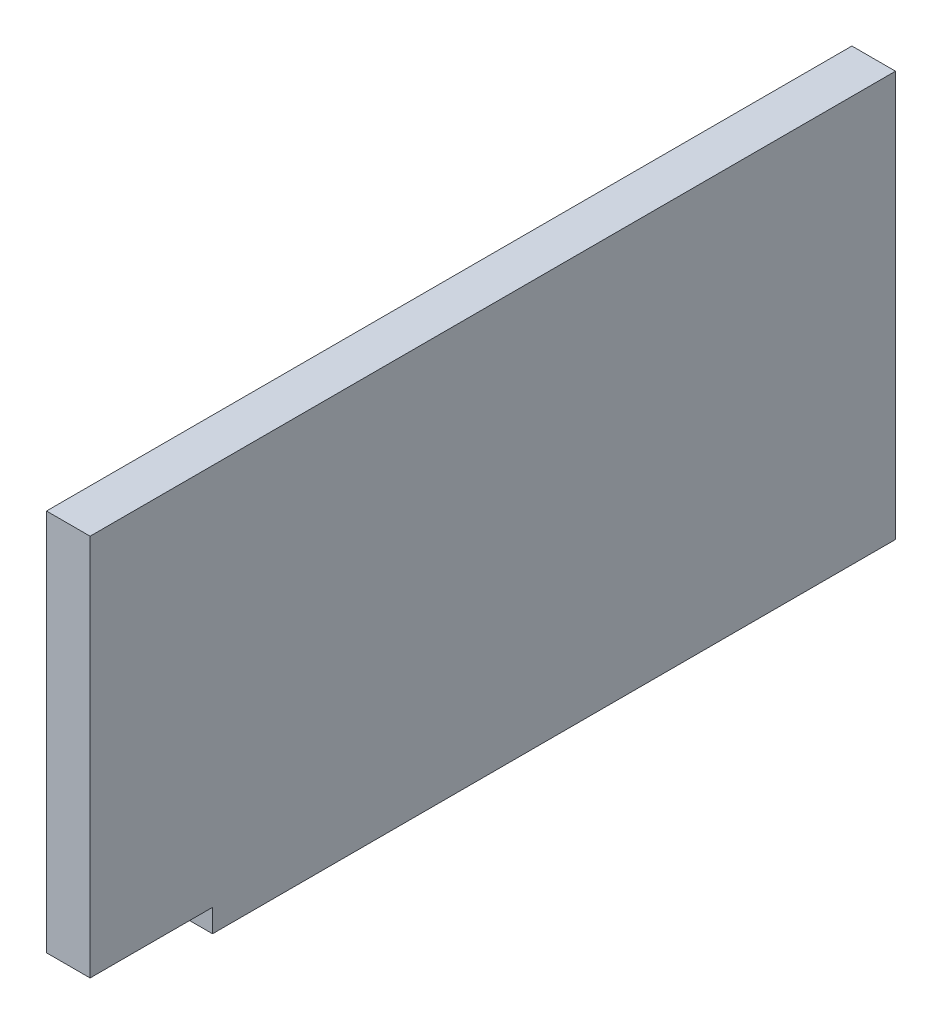
ISO-10303-21;
HEADER;
FILE_DESCRIPTION(('STEP AP214'),'2;1');
FILE_NAME('part.step','',(''),(''),'','','');
FILE_SCHEMA(('AUTOMOTIVE_DESIGN { 1 0 10303 214 1 1 1 1 }'));
ENDSEC;
DATA;
#1=APPLICATION_CONTEXT('core data for automotive mechanical design processes');
#2=APPLICATION_PROTOCOL_DEFINITION('international standard','automotive_design',2000,#1);
#3=PRODUCT_CONTEXT('',#1,'mechanical');
#4=PRODUCT('Part','Part','',(#3));
#5=PRODUCT_RELATED_PRODUCT_CATEGORY('part','',(#4));
#6=PRODUCT_DEFINITION_FORMATION('','',#4);
#7=PRODUCT_DEFINITION_CONTEXT('part definition',#1,'design');
#8=PRODUCT_DEFINITION('design','',#6,#7);
#9=PRODUCT_DEFINITION_SHAPE('','',#8);
#10=(LENGTH_UNIT() NAMED_UNIT(*) SI_UNIT(.MILLI.,.METRE.));
#11=(NAMED_UNIT(*) PLANE_ANGLE_UNIT() SI_UNIT($,.RADIAN.));
#12=(NAMED_UNIT(*) SI_UNIT($,.STERADIAN.) SOLID_ANGLE_UNIT());
#13=UNCERTAINTY_MEASURE_WITH_UNIT(LENGTH_MEASURE(1.E-05),#10,'distance_accuracy_value','');
#14=(GEOMETRIC_REPRESENTATION_CONTEXT(3) GLOBAL_UNCERTAINTY_ASSIGNED_CONTEXT((#13)) GLOBAL_UNIT_ASSIGNED_CONTEXT((#10,
#11,#12)) REPRESENTATION_CONTEXT('',''));
#15=CARTESIAN_POINT('',(0.,0.,0.));
#16=DIRECTION('',(0.,0.,1.));
#17=DIRECTION('',(1.,0.,0.));
#18=AXIS2_PLACEMENT_3D('',#15,#16,#17);
#19=CARTESIAN_POINT('',(-2.85,26.5,52.625));
#20=DIRECTION('',(0.,-1.,0.));
#21=DIRECTION('',(0.,0.,-1.));
#22=AXIS2_PLACEMENT_3D('',#19,#20,#21);
#23=PLANE('',#22);
#24=DIRECTION('',(1.,0.,0.));
#25=VECTOR('',#24,1.);
#26=CARTESIAN_POINT('',(-2.85,26.5,52.625));
#27=LINE('',#26,#25);
#28=CARTESIAN_POINT('',(-2.85,26.5,52.625));
#29=VERTEX_POINT('',#28);
#30=CARTESIAN_POINT('',(2.85,26.5,52.625));
#31=VERTEX_POINT('',#30);
#32=EDGE_CURVE('E63',#29,#31,#27,.T.);
#33=ORIENTED_EDGE('',*,*,#32,.T.);
#34=DIRECTION('',(0.,0.,-1.));
#35=VECTOR('',#34,1.);
#36=CARTESIAN_POINT('',(2.85,26.5,52.625));
#37=LINE('',#36,#35);
#38=CARTESIAN_POINT('',(2.85,26.5,-52.625));
#39=VERTEX_POINT('',#38);
#40=EDGE_CURVE('E130',#31,#39,#37,.T.);
#41=ORIENTED_EDGE('',*,*,#40,.T.);
#42=DIRECTION('',(1.,0.,0.));
#43=VECTOR('',#42,1.);
#44=CARTESIAN_POINT('',(-2.85,26.5,-52.625));
#45=LINE('',#44,#43);
#46=CARTESIAN_POINT('',(-2.85,26.5,-52.625));
#47=VERTEX_POINT('',#46);
#48=EDGE_CURVE('E11',#47,#39,#45,.T.);
#49=ORIENTED_EDGE('',*,*,#48,.F.);
#50=DIRECTION('',(0.,0.,-1.));
#51=VECTOR('',#50,1.);
#52=CARTESIAN_POINT('',(-2.85,26.5,52.625));
#53=LINE('',#52,#51);
#54=EDGE_CURVE('E117',#29,#47,#53,.T.);
#55=ORIENTED_EDGE('',*,*,#54,.F.);
#56=EDGE_LOOP('',(#33,#41,#49,#55));
#57=FACE_BOUND('',#56,.T.);
#58=ADVANCED_FACE('F41',(#57),#23,.F.);
#59=CARTESIAN_POINT('',(-2.85,26.5,-52.625));
#60=DIRECTION('',(0.,0.,1.));
#61=DIRECTION('',(1.,0.,0.));
#62=AXIS2_PLACEMENT_3D('',#59,#60,#61);
#63=PLANE('',#62);
#64=ORIENTED_EDGE('',*,*,#48,.T.);
#65=DIRECTION('',(0.,-1.,0.));
#66=VECTOR('',#65,1.);
#67=CARTESIAN_POINT('',(2.85,26.5,-52.625));
#68=LINE('',#67,#66);
#69=CARTESIAN_POINT('',(2.85,-26.5,-52.625));
#70=VERTEX_POINT('',#69);
#71=EDGE_CURVE('E124',#39,#70,#68,.T.);
#72=ORIENTED_EDGE('',*,*,#71,.T.);
#73=DIRECTION('',(1.,0.,0.));
#74=VECTOR('',#73,1.);
#75=CARTESIAN_POINT('',(-2.85,-26.5,-52.625));
#76=LINE('',#75,#74);
#77=CARTESIAN_POINT('',(-2.85,-26.5,-52.625));
#78=VERTEX_POINT('',#77);
#79=EDGE_CURVE('E48',#78,#70,#76,.T.);
#80=ORIENTED_EDGE('',*,*,#79,.F.);
#81=DIRECTION('',(0.,-1.,0.));
#82=VECTOR('',#81,1.);
#83=CARTESIAN_POINT('',(-2.85,26.5,-52.625));
#84=LINE('',#83,#82);
#85=EDGE_CURVE('E112',#47,#78,#84,.T.);
#86=ORIENTED_EDGE('',*,*,#85,.F.);
#87=EDGE_LOOP('',(#64,#72,#80,#86));
#88=FACE_BOUND('',#87,.T.);
#89=ADVANCED_FACE('F125',(#88),#63,.F.);
#90=CARTESIAN_POINT('',(-2.85,-26.5,52.625));
#91=DIRECTION('',(0.,-1.,0.));
#92=DIRECTION('',(0.,0.,-1.));
#93=AXIS2_PLACEMENT_3D('',#90,#91,#92);
#94=PLANE('',#93);
#95=DIRECTION('',(1.,0.,0.));
#96=VECTOR('',#95,1.);
#97=CARTESIAN_POINT('',(-2.85,-26.5,36.625));
#98=LINE('',#97,#96);
#99=CARTESIAN_POINT('',(-2.85,-26.5,36.625));
#100=VERTEX_POINT('',#99);
#101=CARTESIAN_POINT('',(2.85,-26.5,36.625));
#102=VERTEX_POINT('',#101);
#103=EDGE_CURVE('E55',#100,#102,#98,.T.);
#104=ORIENTED_EDGE('',*,*,#103,.F.);
#105=DIRECTION('',(0.,0.,-1.));
#106=VECTOR('',#105,1.);
#107=CARTESIAN_POINT('',(-2.85,-26.5,52.625));
#108=LINE('',#107,#106);
#109=EDGE_CURVE('E106',#100,#78,#108,.T.);
#110=ORIENTED_EDGE('',*,*,#109,.T.);
#111=ORIENTED_EDGE('',*,*,#79,.T.);
#112=DIRECTION('',(0.,0.,-1.));
#113=VECTOR('',#112,1.);
#114=CARTESIAN_POINT('',(2.85,-26.5,52.625));
#115=LINE('',#114,#113);
#116=EDGE_CURVE('E108',#102,#70,#115,.T.);
#117=ORIENTED_EDGE('',*,*,#116,.F.);
#118=EDGE_LOOP('',(#104,#110,#111,#117));
#119=FACE_BOUND('',#118,.T.);
#120=ADVANCED_FACE('F104',(#119),#94,.T.);
#121=CARTESIAN_POINT('',(-2.85,26.5,52.625));
#122=DIRECTION('',(0.,0.,1.));
#123=DIRECTION('',(1.,0.,0.));
#124=AXIS2_PLACEMENT_3D('',#121,#122,#123);
#125=PLANE('',#124);
#126=DIRECTION('',(1.,0.,0.));
#127=VECTOR('',#126,1.);
#128=CARTESIAN_POINT('',(-2.85,-23.5,52.625));
#129=LINE('',#128,#127);
#130=CARTESIAN_POINT('',(-2.85,-23.5,52.625));
#131=VERTEX_POINT('',#130);
#132=CARTESIAN_POINT('',(2.85,-23.5,52.625));
#133=VERTEX_POINT('',#132);
#134=EDGE_CURVE('E134',#131,#133,#129,.T.);
#135=ORIENTED_EDGE('',*,*,#134,.T.);
#136=DIRECTION('',(0.,-1.,0.));
#137=VECTOR('',#136,1.);
#138=CARTESIAN_POINT('',(2.85,26.5,52.625));
#139=LINE('',#138,#137);
#140=EDGE_CURVE('E132',#31,#133,#139,.T.);
#141=ORIENTED_EDGE('',*,*,#140,.F.);
#142=ORIENTED_EDGE('',*,*,#32,.F.);
#143=DIRECTION('',(0.,-1.,0.));
#144=VECTOR('',#143,1.);
#145=CARTESIAN_POINT('',(-2.85,26.5,52.625));
#146=LINE('',#145,#144);
#147=EDGE_CURVE('E114',#29,#131,#146,.T.);
#148=ORIENTED_EDGE('',*,*,#147,.T.);
#149=EDGE_LOOP('',(#135,#141,#142,#148));
#150=FACE_BOUND('',#149,.T.);
#151=ADVANCED_FACE('F143',(#150),#125,.T.);
#152=CARTESIAN_POINT('',(-2.85,0.,0.));
#153=DIRECTION('',(-1.,0.,0.));
#154=DIRECTION('',(0.,0.,1.));
#155=AXIS2_PLACEMENT_3D('',#152,#153,#154);
#156=PLANE('',#155);
#157=DIRECTION('',(0.,0.,1.));
#158=VECTOR('',#157,1.);
#159=CARTESIAN_POINT('',(-2.85,-23.5,52.625));
#160=LINE('',#159,#158);
#161=CARTESIAN_POINT('',(-2.85,-23.5,36.625));
#162=VERTEX_POINT('',#161);
#163=EDGE_CURVE('E99',#162,#131,#160,.T.);
#164=ORIENTED_EDGE('',*,*,#163,.T.);
#165=ORIENTED_EDGE('',*,*,#147,.F.);
#166=ORIENTED_EDGE('',*,*,#54,.T.);
#167=ORIENTED_EDGE('',*,*,#85,.T.);
#168=ORIENTED_EDGE('',*,*,#109,.F.);
#169=DIRECTION('',(0.,1.,0.));
#170=VECTOR('',#169,1.);
#171=CARTESIAN_POINT('',(-2.85,-26.5,36.625));
#172=LINE('',#171,#170);
#173=EDGE_CURVE('E92',#100,#162,#172,.T.);
#174=ORIENTED_EDGE('',*,*,#173,.T.);
#175=EDGE_LOOP('',(#164,#165,#166,#167,#168,#174));
#176=FACE_BOUND('',#175,.T.);
#177=ADVANCED_FACE('F110',(#176),#156,.T.);
#178=CARTESIAN_POINT('',(2.85,0.,0.));
#179=DIRECTION('',(-1.,0.,0.));
#180=DIRECTION('',(0.,0.,1.));
#181=AXIS2_PLACEMENT_3D('',#178,#179,#180);
#182=PLANE('',#181);
#183=ORIENTED_EDGE('',*,*,#140,.T.);
#184=DIRECTION('',(0.,0.,1.));
#185=VECTOR('',#184,1.);
#186=CARTESIAN_POINT('',(2.85,-23.5,52.625));
#187=LINE('',#186,#185);
#188=CARTESIAN_POINT('',(2.85,-23.5,36.625));
#189=VERTEX_POINT('',#188);
#190=EDGE_CURVE('E100',#189,#133,#187,.T.);
#191=ORIENTED_EDGE('',*,*,#190,.F.);
#192=DIRECTION('',(0.,1.,0.));
#193=VECTOR('',#192,1.);
#194=CARTESIAN_POINT('',(2.85,-26.5,36.625));
#195=LINE('',#194,#193);
#196=EDGE_CURVE('E149',#102,#189,#195,.T.);
#197=ORIENTED_EDGE('',*,*,#196,.F.);
#198=ORIENTED_EDGE('',*,*,#116,.T.);
#199=ORIENTED_EDGE('',*,*,#71,.F.);
#200=ORIENTED_EDGE('',*,*,#40,.F.);
#201=EDGE_LOOP('',(#183,#191,#197,#198,#199,#200));
#202=FACE_BOUND('',#201,.T.);
#203=ADVANCED_FACE('F140',(#202),#182,.F.);
#204=CARTESIAN_POINT('',(-2.85,-23.5,52.625));
#205=DIRECTION('',(0.,1.,0.));
#206=DIRECTION('',(0.,0.,1.));
#207=AXIS2_PLACEMENT_3D('',#204,#205,#206);
#208=PLANE('',#207);
#209=ORIENTED_EDGE('',*,*,#190,.T.);
#210=ORIENTED_EDGE('',*,*,#134,.F.);
#211=ORIENTED_EDGE('',*,*,#163,.F.);
#212=DIRECTION('',(1.,0.,0.));
#213=VECTOR('',#212,1.);
#214=CARTESIAN_POINT('',(-2.85,-23.5,36.625));
#215=LINE('',#214,#213);
#216=EDGE_CURVE('E94',#162,#189,#215,.T.);
#217=ORIENTED_EDGE('',*,*,#216,.T.);
#218=EDGE_LOOP('',(#209,#210,#211,#217));
#219=FACE_BOUND('',#218,.T.);
#220=ADVANCED_FACE('F151',(#219),#208,.F.);
#221=CARTESIAN_POINT('',(-2.85,-26.5,36.625));
#222=DIRECTION('',(0.,0.,-1.));
#223=DIRECTION('',(-1.,0.,0.));
#224=AXIS2_PLACEMENT_3D('',#221,#222,#223);
#225=PLANE('',#224);
#226=ORIENTED_EDGE('',*,*,#196,.T.);
#227=ORIENTED_EDGE('',*,*,#216,.F.);
#228=ORIENTED_EDGE('',*,*,#173,.F.);
#229=ORIENTED_EDGE('',*,*,#103,.T.);
#230=EDGE_LOOP('',(#226,#227,#228,#229));
#231=FACE_BOUND('',#230,.T.);
#232=ADVANCED_FACE('F93',(#231),#225,.F.);
#233=CLOSED_SHELL('',(#58,#89,#120,#151,#177,#203,#220,#232));
#234=MANIFOLD_SOLID_BREP('B2',#233);
#235=ADVANCED_BREP_SHAPE_REPRESENTATION('',(#18,#234),#14);
#236=SHAPE_DEFINITION_REPRESENTATION(#9,#235);
ENDSEC;
END-ISO-10303-21;
